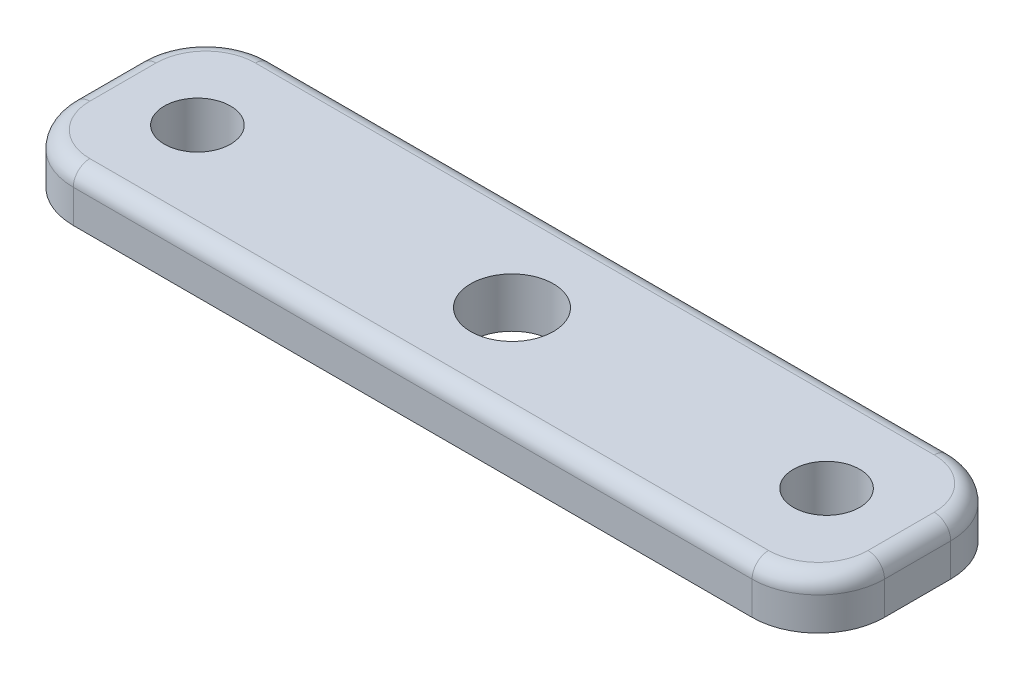
ISO-10303-21;
HEADER;
FILE_DESCRIPTION(('STEP AP214'),'2;1');
FILE_NAME('part.step','',(''),(''),'','','');
FILE_SCHEMA(('AUTOMOTIVE_DESIGN { 1 0 10303 214 1 1 1 1 }'));
ENDSEC;
DATA;
#1=APPLICATION_CONTEXT('core data for automotive mechanical design processes');
#2=APPLICATION_PROTOCOL_DEFINITION('international standard','automotive_design',2000,#1);
#3=PRODUCT_CONTEXT('',#1,'mechanical');
#4=PRODUCT('Part','Part','',(#3));
#5=PRODUCT_RELATED_PRODUCT_CATEGORY('part','',(#4));
#6=PRODUCT_DEFINITION_FORMATION('','',#4);
#7=PRODUCT_DEFINITION_CONTEXT('part definition',#1,'design');
#8=PRODUCT_DEFINITION('design','',#6,#7);
#9=PRODUCT_DEFINITION_SHAPE('','',#8);
#10=(LENGTH_UNIT() NAMED_UNIT(*) SI_UNIT(.MILLI.,.METRE.));
#11=(NAMED_UNIT(*) PLANE_ANGLE_UNIT() SI_UNIT($,.RADIAN.));
#12=(NAMED_UNIT(*) SI_UNIT($,.STERADIAN.) SOLID_ANGLE_UNIT());
#13=UNCERTAINTY_MEASURE_WITH_UNIT(LENGTH_MEASURE(1.E-05),#10,'distance_accuracy_value','');
#14=(GEOMETRIC_REPRESENTATION_CONTEXT(3) GLOBAL_UNCERTAINTY_ASSIGNED_CONTEXT((#13)) GLOBAL_UNIT_ASSIGNED_CONTEXT((#10,
#11,#12)) REPRESENTATION_CONTEXT('',''));
#15=CARTESIAN_POINT('',(0.,0.,0.));
#16=DIRECTION('',(0.,0.,1.));
#17=DIRECTION('',(1.,0.,0.));
#18=AXIS2_PLACEMENT_3D('',#15,#16,#17);
#19=CARTESIAN_POINT('',(39.5,3.,-2.));
#20=DIRECTION('',(0.,-1.,0.));
#21=DIRECTION('',(0.,0.,-1.));
#22=AXIS2_PLACEMENT_3D('',#19,#20,#21);
#23=PLANE('',#22);
#24=DIRECTION('',(0.,0.,1.));
#25=VECTOR('',#24,1.);
#26=CARTESIAN_POINT('',(-4.5,3.,-2.00000000000008));
#27=LINE('',#26,#25);
#28=CARTESIAN_POINT('',(-4.49999999999999,3.,-1.99999999999997));
#29=VERTEX_POINT('',#28);
#30=CARTESIAN_POINT('',(-4.5,3.,1.99999999999998));
#31=VERTEX_POINT('',#30);
#32=EDGE_CURVE('E224',#29,#31,#27,.T.);
#33=ORIENTED_EDGE('',*,*,#32,.T.);
#34=CARTESIAN_POINT('',(-1.5,3.,2.));
#35=DIRECTION('',(0.,-1.,0.));
#36=DIRECTION('',(0.,0.,-1.));
#37=AXIS2_PLACEMENT_3D('',#34,#35,#36);
#38=CIRCLE('',#37,3.);
#39=CARTESIAN_POINT('',(-1.49999999999998,3.,5.));
#40=VERTEX_POINT('',#39);
#41=EDGE_CURVE('E227',#31,#40,#38,.F.);
#42=ORIENTED_EDGE('',*,*,#41,.T.);
#43=DIRECTION('',(1.,0.,0.));
#44=VECTOR('',#43,1.);
#45=CARTESIAN_POINT('',(39.5,3.,5.));
#46=LINE('',#45,#44);
#47=CARTESIAN_POINT('',(39.5,3.,5.));
#48=VERTEX_POINT('',#47);
#49=EDGE_CURVE('E141',#40,#48,#46,.T.);
#50=ORIENTED_EDGE('',*,*,#49,.T.);
#51=CARTESIAN_POINT('',(39.5,3.,2.));
#52=DIRECTION('',(0.,-1.,0.));
#53=DIRECTION('',(0.,0.,-1.));
#54=AXIS2_PLACEMENT_3D('',#51,#52,#53);
#55=CIRCLE('',#54,3.);
#56=CARTESIAN_POINT('',(42.5,3.,1.99999999999997));
#57=VERTEX_POINT('',#56);
#58=EDGE_CURVE('E209',#48,#57,#55,.F.);
#59=ORIENTED_EDGE('',*,*,#58,.T.);
#60=DIRECTION('',(0.,0.,-1.));
#61=VECTOR('',#60,1.);
#62=CARTESIAN_POINT('',(42.5,3.,-2.));
#63=LINE('',#62,#61);
#64=CARTESIAN_POINT('',(42.5,3.,-1.99999999999998));
#65=VERTEX_POINT('',#64);
#66=EDGE_CURVE('E212',#57,#65,#63,.T.);
#67=ORIENTED_EDGE('',*,*,#66,.T.);
#68=CARTESIAN_POINT('',(39.5,3.,-2.));
#69=DIRECTION('',(0.,-1.,0.));
#70=DIRECTION('',(0.,0.,-1.));
#71=AXIS2_PLACEMENT_3D('',#68,#69,#70);
#72=CIRCLE('',#71,3.);
#73=CARTESIAN_POINT('',(39.5,3.,-5.));
#74=VERTEX_POINT('',#73);
#75=EDGE_CURVE('E215',#65,#74,#72,.F.);
#76=ORIENTED_EDGE('',*,*,#75,.T.);
#77=DIRECTION('',(-1.,0.,0.));
#78=VECTOR('',#77,1.);
#79=CARTESIAN_POINT('',(39.5,3.,-5.));
#80=LINE('',#79,#78);
#81=CARTESIAN_POINT('',(-1.49999999999997,3.,-5.));
#82=VERTEX_POINT('',#81);
#83=EDGE_CURVE('E218',#74,#82,#80,.T.);
#84=ORIENTED_EDGE('',*,*,#83,.T.);
#85=CARTESIAN_POINT('',(-1.5,3.,-2.));
#86=DIRECTION('',(0.,-1.,0.));
#87=DIRECTION('',(0.,0.,-1.));
#88=AXIS2_PLACEMENT_3D('',#85,#86,#87);
#89=CIRCLE('',#88,3.);
#90=EDGE_CURVE('E221',#82,#29,#89,.F.);
#91=ORIENTED_EDGE('',*,*,#90,.T.);
#92=EDGE_LOOP('',(#33,#42,#50,#59,#67,#76,#84,#91));
#93=FACE_BOUND('',#92,.T.);
#94=CARTESIAN_POINT('',(0.,3.,0.));
#95=DIRECTION('',(0.,1.,0.));
#96=DIRECTION('',(0.,0.,1.));
#97=AXIS2_PLACEMENT_3D('',#94,#95,#96);
#98=CIRCLE('',#97,2.);
#99=CARTESIAN_POINT('',(0.,3.,2.));
#100=VERTEX_POINT('',#99);
#101=EDGE_CURVE('E159',#100,#100,#98,.T.);
#102=ORIENTED_EDGE('',*,*,#101,.F.);
#103=EDGE_LOOP('',(#102));
#104=FACE_BOUND('',#103,.T.);
#105=CARTESIAN_POINT('',(38.,3.,0.));
#106=DIRECTION('',(0.,1.,0.));
#107=DIRECTION('',(0.,0.,1.));
#108=AXIS2_PLACEMENT_3D('',#105,#106,#107);
#109=CIRCLE('',#108,2.);
#110=CARTESIAN_POINT('',(38.,3.,2.));
#111=VERTEX_POINT('',#110);
#112=EDGE_CURVE('E294',#111,#111,#109,.T.);
#113=ORIENTED_EDGE('',*,*,#112,.F.);
#114=EDGE_LOOP('',(#113));
#115=FACE_BOUND('',#114,.T.);
#116=CARTESIAN_POINT('',(19.0503363456008,3.,0.0503363456008429));
#117=DIRECTION('',(0.,1.,0.));
#118=DIRECTION('',(0.,0.,1.));
#119=AXIS2_PLACEMENT_3D('',#116,#117,#118);
#120=CIRCLE('',#119,2.5);
#121=CARTESIAN_POINT('',(19.0503363456008,3.,2.55033634560084));
#122=VERTEX_POINT('',#121);
#123=EDGE_CURVE('E285',#122,#122,#120,.T.);
#124=ORIENTED_EDGE('',*,*,#123,.F.);
#125=EDGE_LOOP('',(#124));
#126=FACE_BOUND('',#125,.T.);
#127=ADVANCED_FACE('F38',(#93,#104,#115,#126),#23,.F.);
#128=CARTESIAN_POINT('',(39.5,0.,-2.));
#129=DIRECTION('',(0.,-1.,0.));
#130=DIRECTION('',(0.,0.,-1.));
#131=AXIS2_PLACEMENT_3D('',#128,#129,#130);
#132=PLANE('',#131);
#133=CARTESIAN_POINT('',(38.,0.,0.));
#134=DIRECTION('',(0.,1.,0.));
#135=DIRECTION('',(0.,0.,1.));
#136=AXIS2_PLACEMENT_3D('',#133,#134,#135);
#137=CIRCLE('',#136,2.);
#138=CARTESIAN_POINT('',(38.,0.,2.));
#139=VERTEX_POINT('',#138);
#140=EDGE_CURVE('E291',#139,#139,#137,.T.);
#141=ORIENTED_EDGE('',*,*,#140,.T.);
#142=EDGE_LOOP('',(#141));
#143=FACE_BOUND('',#142,.T.);
#144=CARTESIAN_POINT('',(39.5,0.,-2.));
#145=DIRECTION('',(0.,1.,0.));
#146=DIRECTION('',(0.,0.,-1.));
#147=AXIS2_PLACEMENT_3D('',#144,#145,#146);
#148=CIRCLE('',#147,4.);
#149=CARTESIAN_POINT('',(43.5,0.,-1.99999999999997));
#150=VERTEX_POINT('',#149);
#151=CARTESIAN_POINT('',(39.5,0.,-6.));
#152=VERTEX_POINT('',#151);
#153=EDGE_CURVE('E149',#150,#152,#148,.T.);
#154=ORIENTED_EDGE('',*,*,#153,.F.);
#155=DIRECTION('',(0.,0.,-1.));
#156=VECTOR('',#155,1.);
#157=CARTESIAN_POINT('',(43.5,0.,-1.99999999999997));
#158=LINE('',#157,#156);
#159=CARTESIAN_POINT('',(43.5,0.,1.99999999999997));
#160=VERTEX_POINT('',#159);
#161=EDGE_CURVE('E185',#160,#150,#158,.T.);
#162=ORIENTED_EDGE('',*,*,#161,.F.);
#163=CARTESIAN_POINT('',(39.5,0.,2.));
#164=DIRECTION('',(0.,1.,0.));
#165=DIRECTION('',(0.,0.,-1.));
#166=AXIS2_PLACEMENT_3D('',#163,#164,#165);
#167=CIRCLE('',#166,4.);
#168=CARTESIAN_POINT('',(39.5,0.,6.));
#169=VERTEX_POINT('',#168);
#170=EDGE_CURVE('E181',#169,#160,#167,.T.);
#171=ORIENTED_EDGE('',*,*,#170,.F.);
#172=DIRECTION('',(1.,0.,0.));
#173=VECTOR('',#172,1.);
#174=CARTESIAN_POINT('',(-1.49999999999997,0.,6.));
#175=LINE('',#174,#173);
#176=CARTESIAN_POINT('',(-1.49999999999997,0.,6.));
#177=VERTEX_POINT('',#176);
#178=EDGE_CURVE('E177',#177,#169,#175,.T.);
#179=ORIENTED_EDGE('',*,*,#178,.F.);
#180=CARTESIAN_POINT('',(-1.5,0.,2.));
#181=DIRECTION('',(0.,1.,0.));
#182=DIRECTION('',(0.,0.,-1.));
#183=AXIS2_PLACEMENT_3D('',#180,#181,#182);
#184=CIRCLE('',#183,4.);
#185=CARTESIAN_POINT('',(-5.5,0.,1.99999999999997));
#186=VERTEX_POINT('',#185);
#187=EDGE_CURVE('E173',#186,#177,#184,.T.);
#188=ORIENTED_EDGE('',*,*,#187,.F.);
#189=DIRECTION('',(0.,0.,1.));
#190=VECTOR('',#189,1.);
#191=CARTESIAN_POINT('',(-5.49999999999999,0.,-1.99999999999997));
#192=LINE('',#191,#190);
#193=CARTESIAN_POINT('',(-5.49999999999999,0.,-1.99999999999997));
#194=VERTEX_POINT('',#193);
#195=EDGE_CURVE('E169',#194,#186,#192,.T.);
#196=ORIENTED_EDGE('',*,*,#195,.F.);
#197=CARTESIAN_POINT('',(-1.5,0.,-2.));
#198=DIRECTION('',(0.,1.,0.));
#199=DIRECTION('',(0.,0.,1.));
#200=AXIS2_PLACEMENT_3D('',#197,#198,#199);
#201=CIRCLE('',#200,4.);
#202=CARTESIAN_POINT('',(-1.49999999999997,0.,-6.));
#203=VERTEX_POINT('',#202);
#204=EDGE_CURVE('E152',#203,#194,#201,.T.);
#205=ORIENTED_EDGE('',*,*,#204,.F.);
#206=DIRECTION('',(-1.,0.,0.));
#207=VECTOR('',#206,1.);
#208=CARTESIAN_POINT('',(-1.49999999999997,0.,-6.));
#209=LINE('',#208,#207);
#210=EDGE_CURVE('E133',#152,#203,#209,.T.);
#211=ORIENTED_EDGE('',*,*,#210,.F.);
#212=EDGE_LOOP('',(#154,#162,#171,#179,#188,#196,#205,#211));
#213=FACE_BOUND('',#212,.T.);
#214=CARTESIAN_POINT('',(0.,0.,0.));
#215=DIRECTION('',(0.,1.,0.));
#216=DIRECTION('',(0.,0.,1.));
#217=AXIS2_PLACEMENT_3D('',#214,#215,#216);
#218=CIRCLE('',#217,2.);
#219=CARTESIAN_POINT('',(0.,0.,2.));
#220=VERTEX_POINT('',#219);
#221=EDGE_CURVE('E163',#220,#220,#218,.T.);
#222=ORIENTED_EDGE('',*,*,#221,.T.);
#223=EDGE_LOOP('',(#222));
#224=FACE_BOUND('',#223,.T.);
#225=CARTESIAN_POINT('',(19.0503363456008,0.,0.0503363456008429));
#226=DIRECTION('',(0.,1.,0.));
#227=DIRECTION('',(0.,0.,1.));
#228=AXIS2_PLACEMENT_3D('',#225,#226,#227);
#229=CIRCLE('',#228,2.5);
#230=CARTESIAN_POINT('',(19.0503363456008,0.,2.55033634560084));
#231=VERTEX_POINT('',#230);
#232=EDGE_CURVE('E279',#231,#231,#229,.T.);
#233=ORIENTED_EDGE('',*,*,#232,.T.);
#234=EDGE_LOOP('',(#233));
#235=FACE_BOUND('',#234,.T.);
#236=ADVANCED_FACE('F146',(#143,#213,#224,#235),#132,.T.);
#237=CARTESIAN_POINT('',(39.5,3.,-2.));
#238=DIRECTION('',(0.,-1.,0.));
#239=DIRECTION('',(0.,0.,-1.));
#240=AXIS2_PLACEMENT_3D('',#237,#238,#239);
#241=CYLINDRICAL_SURFACE('',#240,4.);
#242=DIRECTION('',(0.,-1.,0.));
#243=VECTOR('',#242,1.);
#244=CARTESIAN_POINT('',(39.5,3.,-6.));
#245=LINE('',#244,#243);
#246=CARTESIAN_POINT('',(39.5,2.,-6.));
#247=VERTEX_POINT('',#246);
#248=EDGE_CURVE('E129',#247,#152,#245,.T.);
#249=ORIENTED_EDGE('',*,*,#248,.F.);
#250=CARTESIAN_POINT('',(39.5,2.,-2.));
#251=DIRECTION('',(0.,-1.,0.));
#252=DIRECTION('',(0.,0.,-1.));
#253=AXIS2_PLACEMENT_3D('',#250,#251,#252);
#254=CIRCLE('',#253,4.);
#255=CARTESIAN_POINT('',(43.5,2.,-1.99999999999997));
#256=VERTEX_POINT('',#255);
#257=EDGE_CURVE('E243',#247,#256,#254,.T.);
#258=ORIENTED_EDGE('',*,*,#257,.T.);
#259=DIRECTION('',(0.,-1.,0.));
#260=VECTOR('',#259,1.);
#261=CARTESIAN_POINT('',(43.5,3.,-1.99999999999997));
#262=LINE('',#261,#260);
#263=EDGE_CURVE('E156',#256,#150,#262,.T.);
#264=ORIENTED_EDGE('',*,*,#263,.T.);
#265=ORIENTED_EDGE('',*,*,#153,.T.);
#266=EDGE_LOOP('',(#249,#258,#264,#265));
#267=FACE_BOUND('',#266,.T.);
#268=ADVANCED_FACE('F155',(#267),#241,.T.);
#269=CARTESIAN_POINT('',(-1.49999999999997,3.,-6.));
#270=DIRECTION('',(0.,0.,1.));
#271=DIRECTION('',(1.,0.,0.));
#272=AXIS2_PLACEMENT_3D('',#269,#270,#271);
#273=PLANE('',#272);
#274=DIRECTION('',(0.,-1.,0.));
#275=VECTOR('',#274,1.);
#276=CARTESIAN_POINT('',(-1.49999999999997,3.,-6.));
#277=LINE('',#276,#275);
#278=CARTESIAN_POINT('',(-1.49999999999997,2.,-6.));
#279=VERTEX_POINT('',#278);
#280=EDGE_CURVE('E142',#279,#203,#277,.T.);
#281=ORIENTED_EDGE('',*,*,#280,.F.);
#282=DIRECTION('',(-1.,0.,0.));
#283=VECTOR('',#282,1.);
#284=CARTESIAN_POINT('',(-1.49999999999997,2.,-6.));
#285=LINE('',#284,#283);
#286=EDGE_CURVE('E136',#279,#247,#285,.F.);
#287=ORIENTED_EDGE('',*,*,#286,.T.);
#288=ORIENTED_EDGE('',*,*,#248,.T.);
#289=ORIENTED_EDGE('',*,*,#210,.T.);
#290=EDGE_LOOP('',(#281,#287,#288,#289));
#291=FACE_BOUND('',#290,.T.);
#292=ADVANCED_FACE('F132',(#291),#273,.F.);
#293=CARTESIAN_POINT('',(-1.5,3.,-2.));
#294=DIRECTION('',(0.,-1.,0.));
#295=DIRECTION('',(0.,0.,-1.));
#296=AXIS2_PLACEMENT_3D('',#293,#294,#295);
#297=CYLINDRICAL_SURFACE('',#296,4.);
#298=DIRECTION('',(0.,-1.,0.));
#299=VECTOR('',#298,1.);
#300=CARTESIAN_POINT('',(-5.49999999999999,3.,-1.99999999999997));
#301=LINE('',#300,#299);
#302=CARTESIAN_POINT('',(-5.49999999999999,2.,-1.99999999999997));
#303=VERTEX_POINT('',#302);
#304=EDGE_CURVE('E202',#303,#194,#301,.T.);
#305=ORIENTED_EDGE('',*,*,#304,.F.);
#306=CARTESIAN_POINT('',(-1.5,2.,-2.));
#307=DIRECTION('',(0.,-1.,0.));
#308=DIRECTION('',(0.,0.,-1.));
#309=AXIS2_PLACEMENT_3D('',#306,#307,#308);
#310=CIRCLE('',#309,4.);
#311=EDGE_CURVE('E238',#303,#279,#310,.T.);
#312=ORIENTED_EDGE('',*,*,#311,.T.);
#313=ORIENTED_EDGE('',*,*,#280,.T.);
#314=ORIENTED_EDGE('',*,*,#204,.T.);
#315=EDGE_LOOP('',(#305,#312,#313,#314));
#316=FACE_BOUND('',#315,.T.);
#317=ADVANCED_FACE('F343',(#316),#297,.T.);
#318=CARTESIAN_POINT('',(-5.49999999999999,3.,-1.99999999999997));
#319=DIRECTION('',(1.,0.,0.));
#320=DIRECTION('',(0.,0.,-1.));
#321=AXIS2_PLACEMENT_3D('',#318,#319,#320);
#322=PLANE('',#321);
#323=DIRECTION('',(0.,-1.,0.));
#324=VECTOR('',#323,1.);
#325=CARTESIAN_POINT('',(-5.5,3.,1.99999999999997));
#326=LINE('',#325,#324);
#327=CARTESIAN_POINT('',(-5.5,2.,1.99999999999997));
#328=VERTEX_POINT('',#327);
#329=EDGE_CURVE('E199',#328,#186,#326,.T.);
#330=ORIENTED_EDGE('',*,*,#329,.F.);
#331=DIRECTION('',(0.,0.,1.));
#332=VECTOR('',#331,1.);
#333=CARTESIAN_POINT('',(-5.49999999999999,2.,-1.99999999999997));
#334=LINE('',#333,#332);
#335=EDGE_CURVE('E235',#328,#303,#334,.F.);
#336=ORIENTED_EDGE('',*,*,#335,.T.);
#337=ORIENTED_EDGE('',*,*,#304,.T.);
#338=ORIENTED_EDGE('',*,*,#195,.T.);
#339=EDGE_LOOP('',(#330,#336,#337,#338));
#340=FACE_BOUND('',#339,.T.);
#341=ADVANCED_FACE('F339',(#340),#322,.F.);
#342=CARTESIAN_POINT('',(-1.5,3.,2.));
#343=DIRECTION('',(0.,-1.,0.));
#344=DIRECTION('',(0.,0.,-1.));
#345=AXIS2_PLACEMENT_3D('',#342,#343,#344);
#346=CYLINDRICAL_SURFACE('',#345,4.);
#347=DIRECTION('',(0.,-1.,0.));
#348=VECTOR('',#347,1.);
#349=CARTESIAN_POINT('',(-1.49999999999997,3.,6.));
#350=LINE('',#349,#348);
#351=CARTESIAN_POINT('',(-1.49999999999997,2.,6.));
#352=VERTEX_POINT('',#351);
#353=EDGE_CURVE('E196',#352,#177,#350,.T.);
#354=ORIENTED_EDGE('',*,*,#353,.F.);
#355=CARTESIAN_POINT('',(-1.5,2.,2.));
#356=DIRECTION('',(0.,-1.,0.));
#357=DIRECTION('',(0.,0.,-1.));
#358=AXIS2_PLACEMENT_3D('',#355,#356,#357);
#359=CIRCLE('',#358,4.);
#360=EDGE_CURVE('E231',#352,#328,#359,.T.);
#361=ORIENTED_EDGE('',*,*,#360,.T.);
#362=ORIENTED_EDGE('',*,*,#329,.T.);
#363=ORIENTED_EDGE('',*,*,#187,.T.);
#364=EDGE_LOOP('',(#354,#361,#362,#363));
#365=FACE_BOUND('',#364,.T.);
#366=ADVANCED_FACE('F335',(#365),#346,.T.);
#367=CARTESIAN_POINT('',(-1.49999999999997,3.,6.));
#368=DIRECTION('',(0.,0.,-1.));
#369=DIRECTION('',(-1.,0.,0.));
#370=AXIS2_PLACEMENT_3D('',#367,#368,#369);
#371=PLANE('',#370);
#372=DIRECTION('',(0.,-1.,0.));
#373=VECTOR('',#372,1.);
#374=CARTESIAN_POINT('',(39.5,3.,6.));
#375=LINE('',#374,#373);
#376=CARTESIAN_POINT('',(39.5,2.,6.));
#377=VERTEX_POINT('',#376);
#378=EDGE_CURVE('E193',#377,#169,#375,.T.);
#379=ORIENTED_EDGE('',*,*,#378,.F.);
#380=DIRECTION('',(1.,0.,0.));
#381=VECTOR('',#380,1.);
#382=CARTESIAN_POINT('',(-1.49999999999997,2.,6.));
#383=LINE('',#382,#381);
#384=EDGE_CURVE('E11',#377,#352,#383,.F.);
#385=ORIENTED_EDGE('',*,*,#384,.T.);
#386=ORIENTED_EDGE('',*,*,#353,.T.);
#387=ORIENTED_EDGE('',*,*,#178,.T.);
#388=EDGE_LOOP('',(#379,#385,#386,#387));
#389=FACE_BOUND('',#388,.T.);
#390=ADVANCED_FACE('F332',(#389),#371,.F.);
#391=CARTESIAN_POINT('',(39.5,3.,2.));
#392=DIRECTION('',(0.,-1.,0.));
#393=DIRECTION('',(0.,0.,-1.));
#394=AXIS2_PLACEMENT_3D('',#391,#392,#393);
#395=CYLINDRICAL_SURFACE('',#394,4.);
#396=DIRECTION('',(0.,-1.,0.));
#397=VECTOR('',#396,1.);
#398=CARTESIAN_POINT('',(43.5,3.,1.99999999999997));
#399=LINE('',#398,#397);
#400=CARTESIAN_POINT('',(43.5,2.,1.99999999999997));
#401=VERTEX_POINT('',#400);
#402=EDGE_CURVE('E190',#401,#160,#399,.T.);
#403=ORIENTED_EDGE('',*,*,#402,.F.);
#404=CARTESIAN_POINT('',(39.5,2.,2.));
#405=DIRECTION('',(0.,-1.,0.));
#406=DIRECTION('',(0.,0.,-1.));
#407=AXIS2_PLACEMENT_3D('',#404,#405,#406);
#408=CIRCLE('',#407,4.);
#409=EDGE_CURVE('E48',#401,#377,#408,.T.);
#410=ORIENTED_EDGE('',*,*,#409,.T.);
#411=ORIENTED_EDGE('',*,*,#378,.T.);
#412=ORIENTED_EDGE('',*,*,#170,.T.);
#413=EDGE_LOOP('',(#403,#410,#411,#412));
#414=FACE_BOUND('',#413,.T.);
#415=ADVANCED_FACE('F329',(#414),#395,.T.);
#416=CARTESIAN_POINT('',(43.5,3.,-1.99999999999997));
#417=DIRECTION('',(-1.,0.,0.));
#418=DIRECTION('',(0.,0.,1.));
#419=AXIS2_PLACEMENT_3D('',#416,#417,#418);
#420=PLANE('',#419);
#421=ORIENTED_EDGE('',*,*,#263,.F.);
#422=DIRECTION('',(0.,0.,-1.));
#423=VECTOR('',#422,1.);
#424=CARTESIAN_POINT('',(43.5,2.,-1.99999999999997));
#425=LINE('',#424,#423);
#426=EDGE_CURVE('E63',#256,#401,#425,.F.);
#427=ORIENTED_EDGE('',*,*,#426,.T.);
#428=ORIENTED_EDGE('',*,*,#402,.T.);
#429=ORIENTED_EDGE('',*,*,#161,.T.);
#430=EDGE_LOOP('',(#421,#427,#428,#429));
#431=FACE_BOUND('',#430,.T.);
#432=ADVANCED_FACE('F315',(#431),#420,.F.);
#433=CARTESIAN_POINT('',(0.,3.,0.));
#434=DIRECTION('',(0.,-1.,0.));
#435=DIRECTION('',(0.,0.,-1.));
#436=AXIS2_PLACEMENT_3D('',#433,#434,#435);
#437=CYLINDRICAL_SURFACE('',#436,2.);
#438=ORIENTED_EDGE('',*,*,#101,.T.);
#439=EDGE_LOOP('',(#438));
#440=FACE_BOUND('',#439,.T.);
#441=ORIENTED_EDGE('',*,*,#221,.F.);
#442=EDGE_LOOP('',(#441));
#443=FACE_BOUND('',#442,.T.);
#444=ADVANCED_FACE('F306',(#440,#443),#437,.F.);
#445=CARTESIAN_POINT('',(38.,3.,0.));
#446=DIRECTION('',(0.,-1.,0.));
#447=DIRECTION('',(0.,0.,-1.));
#448=AXIS2_PLACEMENT_3D('',#445,#446,#447);
#449=CYLINDRICAL_SURFACE('',#448,2.);
#450=ORIENTED_EDGE('',*,*,#112,.T.);
#451=EDGE_LOOP('',(#450));
#452=FACE_BOUND('',#451,.T.);
#453=ORIENTED_EDGE('',*,*,#140,.F.);
#454=EDGE_LOOP('',(#453));
#455=FACE_BOUND('',#454,.T.);
#456=ADVANCED_FACE('F303',(#452,#455),#449,.F.);
#457=CARTESIAN_POINT('',(19.0503363456008,3.,0.0503363456008429));
#458=DIRECTION('',(0.,-1.,0.));
#459=DIRECTION('',(0.,0.,-1.));
#460=AXIS2_PLACEMENT_3D('',#457,#458,#459);
#461=CYLINDRICAL_SURFACE('',#460,2.5);
#462=ORIENTED_EDGE('',*,*,#123,.T.);
#463=EDGE_LOOP('',(#462));
#464=FACE_BOUND('',#463,.T.);
#465=ORIENTED_EDGE('',*,*,#232,.F.);
#466=EDGE_LOOP('',(#465));
#467=FACE_BOUND('',#466,.T.);
#468=ADVANCED_FACE('F305',(#464,#467),#461,.F.);
#469=CARTESIAN_POINT('',(39.5,2.,-2.));
#470=DIRECTION('',(0.,-1.,0.));
#471=DIRECTION('',(0.,0.,-1.));
#472=AXIS2_PLACEMENT_3D('',#469,#470,#471);
#473=TOROIDAL_SURFACE('',#472,3.,1.);
#474=CARTESIAN_POINT('',(42.5,2.,-1.99999999999998));
#475=DIRECTION('',(0.,0.,1.));
#476=DIRECTION('',(1.,0.,0.));
#477=AXIS2_PLACEMENT_3D('',#474,#475,#476);
#478=CIRCLE('',#477,1.);
#479=EDGE_CURVE('E271',#256,#65,#478,.T.);
#480=ORIENTED_EDGE('',*,*,#479,.F.);
#481=ORIENTED_EDGE('',*,*,#257,.F.);
#482=CARTESIAN_POINT('',(39.5,2.,-5.));
#483=DIRECTION('',(-1.,0.,0.));
#484=DIRECTION('',(0.,0.,1.));
#485=AXIS2_PLACEMENT_3D('',#482,#483,#484);
#486=CIRCLE('',#485,1.);
#487=EDGE_CURVE('E42',#74,#247,#486,.T.);
#488=ORIENTED_EDGE('',*,*,#487,.F.);
#489=ORIENTED_EDGE('',*,*,#75,.F.);
#490=EDGE_LOOP('',(#480,#481,#488,#489));
#491=FACE_BOUND('',#490,.T.);
#492=ADVANCED_FACE('F40',(#491),#473,.T.);
#493=CARTESIAN_POINT('',(39.5,2.,-5.));
#494=DIRECTION('',(-1.,0.,0.));
#495=DIRECTION('',(0.,0.,1.));
#496=AXIS2_PLACEMENT_3D('',#493,#494,#495);
#497=CYLINDRICAL_SURFACE('',#496,1.);
#498=ORIENTED_EDGE('',*,*,#487,.T.);
#499=ORIENTED_EDGE('',*,*,#286,.F.);
#500=CARTESIAN_POINT('',(-1.49999999999997,2.,-5.));
#501=DIRECTION('',(-1.,0.,0.));
#502=DIRECTION('',(0.,0.,1.));
#503=AXIS2_PLACEMENT_3D('',#500,#501,#502);
#504=CIRCLE('',#503,1.);
#505=EDGE_CURVE('E268',#82,#279,#504,.T.);
#506=ORIENTED_EDGE('',*,*,#505,.F.);
#507=ORIENTED_EDGE('',*,*,#83,.F.);
#508=EDGE_LOOP('',(#498,#499,#506,#507));
#509=FACE_BOUND('',#508,.T.);
#510=ADVANCED_FACE('F374',(#509),#497,.T.);
#511=CARTESIAN_POINT('',(42.5,2.,-2.));
#512=DIRECTION('',(0.,0.,-1.));
#513=DIRECTION('',(-1.,0.,0.));
#514=AXIS2_PLACEMENT_3D('',#511,#512,#513);
#515=CYLINDRICAL_SURFACE('',#514,1.);
#516=ORIENTED_EDGE('',*,*,#479,.T.);
#517=ORIENTED_EDGE('',*,*,#66,.F.);
#518=CARTESIAN_POINT('',(42.5,2.,1.99999999999997));
#519=DIRECTION('',(0.,0.,1.));
#520=DIRECTION('',(1.,0.,0.));
#521=AXIS2_PLACEMENT_3D('',#518,#519,#520);
#522=CIRCLE('',#521,1.);
#523=EDGE_CURVE('E264',#401,#57,#522,.T.);
#524=ORIENTED_EDGE('',*,*,#523,.F.);
#525=ORIENTED_EDGE('',*,*,#426,.F.);
#526=EDGE_LOOP('',(#516,#517,#524,#525));
#527=FACE_BOUND('',#526,.T.);
#528=ADVANCED_FACE('F371',(#527),#515,.T.);
#529=CARTESIAN_POINT('',(-1.5,2.,-2.));
#530=DIRECTION('',(0.,-1.,0.));
#531=DIRECTION('',(0.,0.,-1.));
#532=AXIS2_PLACEMENT_3D('',#529,#530,#531);
#533=TOROIDAL_SURFACE('',#532,3.,1.);
#534=ORIENTED_EDGE('',*,*,#505,.T.);
#535=ORIENTED_EDGE('',*,*,#311,.F.);
#536=CARTESIAN_POINT('',(-4.49999999999999,2.,-1.99999999999997));
#537=DIRECTION('',(0.,0.,1.));
#538=DIRECTION('',(1.,0.,0.));
#539=AXIS2_PLACEMENT_3D('',#536,#537,#538);
#540=CIRCLE('',#539,1.);
#541=EDGE_CURVE('E260',#29,#303,#540,.T.);
#542=ORIENTED_EDGE('',*,*,#541,.F.);
#543=ORIENTED_EDGE('',*,*,#90,.F.);
#544=EDGE_LOOP('',(#534,#535,#542,#543));
#545=FACE_BOUND('',#544,.T.);
#546=ADVANCED_FACE('F367',(#545),#533,.T.);
#547=CARTESIAN_POINT('',(39.5,2.,2.));
#548=DIRECTION('',(0.,-1.,0.));
#549=DIRECTION('',(0.,0.,-1.));
#550=AXIS2_PLACEMENT_3D('',#547,#548,#549);
#551=TOROIDAL_SURFACE('',#550,3.,1.);
#552=ORIENTED_EDGE('',*,*,#523,.T.);
#553=ORIENTED_EDGE('',*,*,#58,.F.);
#554=CARTESIAN_POINT('',(39.5,2.,5.));
#555=DIRECTION('',(-1.,0.,0.));
#556=DIRECTION('',(0.,0.,1.));
#557=AXIS2_PLACEMENT_3D('',#554,#555,#556);
#558=CIRCLE('',#557,1.);
#559=EDGE_CURVE('E256',#377,#48,#558,.T.);
#560=ORIENTED_EDGE('',*,*,#559,.F.);
#561=ORIENTED_EDGE('',*,*,#409,.F.);
#562=EDGE_LOOP('',(#552,#553,#560,#561));
#563=FACE_BOUND('',#562,.T.);
#564=ADVANCED_FACE('F363',(#563),#551,.T.);
#565=CARTESIAN_POINT('',(-4.5,2.,-2.00000000000008));
#566=DIRECTION('',(0.,0.,1.));
#567=DIRECTION('',(1.,0.,0.));
#568=AXIS2_PLACEMENT_3D('',#565,#566,#567);
#569=CYLINDRICAL_SURFACE('',#568,1.);
#570=ORIENTED_EDGE('',*,*,#541,.T.);
#571=ORIENTED_EDGE('',*,*,#335,.F.);
#572=CARTESIAN_POINT('',(-4.5,2.,1.99999999999998));
#573=DIRECTION('',(0.,0.,1.));
#574=DIRECTION('',(1.,0.,0.));
#575=AXIS2_PLACEMENT_3D('',#572,#573,#574);
#576=CIRCLE('',#575,1.);
#577=EDGE_CURVE('E253',#31,#328,#576,.T.);
#578=ORIENTED_EDGE('',*,*,#577,.F.);
#579=ORIENTED_EDGE('',*,*,#32,.F.);
#580=EDGE_LOOP('',(#570,#571,#578,#579));
#581=FACE_BOUND('',#580,.T.);
#582=ADVANCED_FACE('F359',(#581),#569,.T.);
#583=CARTESIAN_POINT('',(39.5,2.,5.));
#584=DIRECTION('',(1.,0.,0.));
#585=DIRECTION('',(0.,0.,-1.));
#586=AXIS2_PLACEMENT_3D('',#583,#584,#585);
#587=CYLINDRICAL_SURFACE('',#586,1.);
#588=ORIENTED_EDGE('',*,*,#559,.T.);
#589=ORIENTED_EDGE('',*,*,#49,.F.);
#590=CARTESIAN_POINT('',(-1.49999999999997,2.,5.));
#591=DIRECTION('',(-1.,0.,0.));
#592=DIRECTION('',(0.,-1.,0.));
#593=AXIS2_PLACEMENT_3D('',#590,#591,#592);
#594=CIRCLE('',#593,1.);
#595=EDGE_CURVE('E250',#352,#40,#594,.T.);
#596=ORIENTED_EDGE('',*,*,#595,.F.);
#597=ORIENTED_EDGE('',*,*,#384,.F.);
#598=EDGE_LOOP('',(#588,#589,#596,#597));
#599=FACE_BOUND('',#598,.T.);
#600=ADVANCED_FACE('F355',(#599),#587,.T.);
#601=CARTESIAN_POINT('',(-1.5,2.,2.));
#602=DIRECTION('',(0.,-1.,0.));
#603=DIRECTION('',(0.,0.,-1.));
#604=AXIS2_PLACEMENT_3D('',#601,#602,#603);
#605=TOROIDAL_SURFACE('',#604,3.,1.);
#606=ORIENTED_EDGE('',*,*,#577,.T.);
#607=ORIENTED_EDGE('',*,*,#360,.F.);
#608=ORIENTED_EDGE('',*,*,#595,.T.);
#609=ORIENTED_EDGE('',*,*,#41,.F.);
#610=EDGE_LOOP('',(#606,#607,#608,#609));
#611=FACE_BOUND('',#610,.T.);
#612=ADVANCED_FACE('F352',(#611),#605,.T.);
#613=CLOSED_SHELL('',(#127,#236,#268,#292,#317,#341,#366,#390,#415,#432,#444,#456,#468,#492,
#510,#528,#546,#564,#582,#600,#612));
#614=MANIFOLD_SOLID_BREP('B2',#613);
#615=ADVANCED_BREP_SHAPE_REPRESENTATION('',(#18,#614),#14);
#616=SHAPE_DEFINITION_REPRESENTATION(#9,#615);
ENDSEC;
END-ISO-10303-21;
